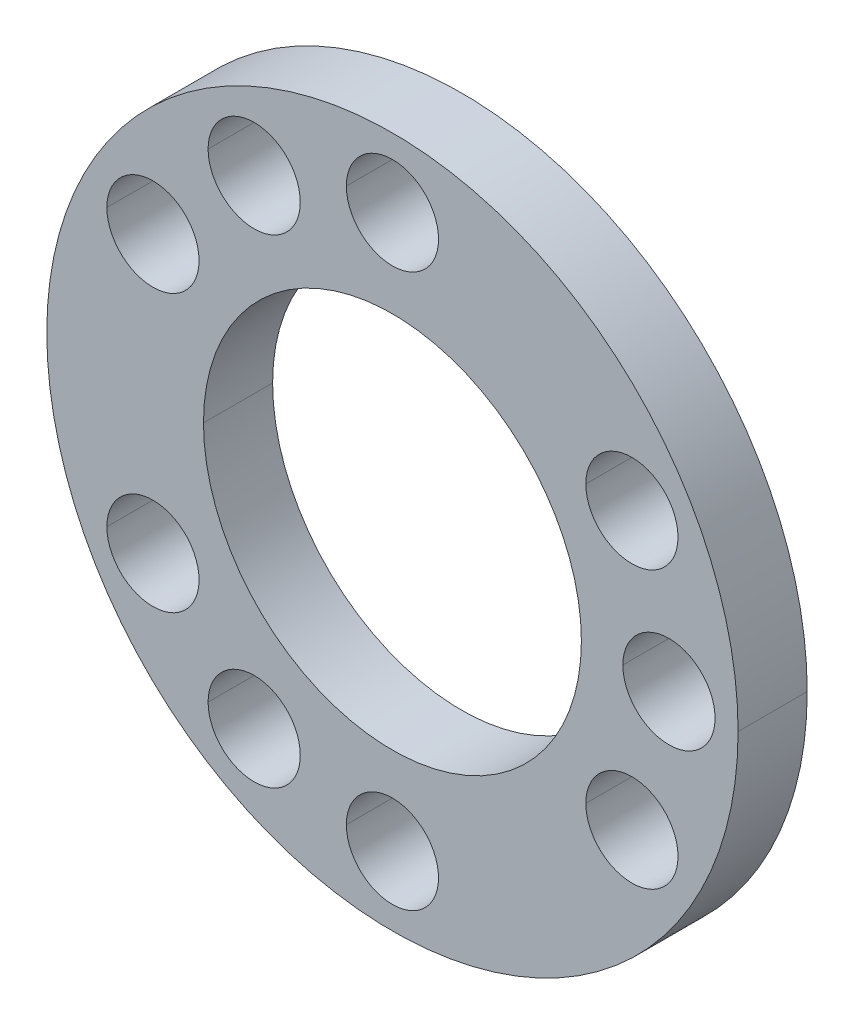
ISO-10303-21;
HEADER;
FILE_DESCRIPTION(('STEP AP214'),'2;1');
FILE_NAME('part.step','',(''),(''),'','','');
FILE_SCHEMA(('AUTOMOTIVE_DESIGN { 1 0 10303 214 1 1 1 1 }'));
ENDSEC;
DATA;
#1=APPLICATION_CONTEXT('core data for automotive mechanical design processes');
#2=APPLICATION_PROTOCOL_DEFINITION('international standard','automotive_design',2000,#1);
#3=PRODUCT_CONTEXT('',#1,'mechanical');
#4=PRODUCT('Part','Part','',(#3));
#5=PRODUCT_RELATED_PRODUCT_CATEGORY('part','',(#4));
#6=PRODUCT_DEFINITION_FORMATION('','',#4);
#7=PRODUCT_DEFINITION_CONTEXT('part definition',#1,'design');
#8=PRODUCT_DEFINITION('design','',#6,#7);
#9=PRODUCT_DEFINITION_SHAPE('','',#8);
#10=(LENGTH_UNIT() NAMED_UNIT(*) SI_UNIT(.MILLI.,.METRE.));
#11=(NAMED_UNIT(*) PLANE_ANGLE_UNIT() SI_UNIT($,.RADIAN.));
#12=(NAMED_UNIT(*) SI_UNIT($,.STERADIAN.) SOLID_ANGLE_UNIT());
#13=UNCERTAINTY_MEASURE_WITH_UNIT(LENGTH_MEASURE(1.E-05),#10,'distance_accuracy_value','');
#14=(GEOMETRIC_REPRESENTATION_CONTEXT(3) GLOBAL_UNCERTAINTY_ASSIGNED_CONTEXT((#13)) GLOBAL_UNIT_ASSIGNED_CONTEXT((#10,
#11,#12)) REPRESENTATION_CONTEXT('',''));
#15=CARTESIAN_POINT('',(0.,0.,0.));
#16=DIRECTION('',(0.,0.,1.));
#17=DIRECTION('',(1.,0.,0.));
#18=AXIS2_PLACEMENT_3D('',#15,#16,#17);
#19=CARTESIAN_POINT('',(0.,0.,-13.));
#20=DIRECTION('',(0.,0.,1.));
#21=DIRECTION('',(1.,0.,0.));
#22=AXIS2_PLACEMENT_3D('',#19,#20,#21);
#23=CYLINDRICAL_SURFACE('',#22,8.2);
#24=CARTESIAN_POINT('',(0.,0.,0.));
#25=DIRECTION('',(0.,0.,1.));
#26=DIRECTION('',(1.,0.,0.));
#27=AXIS2_PLACEMENT_3D('',#24,#25,#26);
#28=CIRCLE('',#27,8.2);
#29=CARTESIAN_POINT('',(-8.2,0.,0.));
#30=VERTEX_POINT('',#29);
#31=CARTESIAN_POINT('',(8.2,0.,0.));
#32=VERTEX_POINT('',#31);
#33=EDGE_CURVE('E42',#30,#32,#28,.T.);
#34=ORIENTED_EDGE('',*,*,#33,.F.);
#35=DIRECTION('',(0.,0.,1.));
#36=VECTOR('',#35,1.);
#37=CARTESIAN_POINT('',(-8.2,0.,-13.));
#38=LINE('',#37,#36);
#39=CARTESIAN_POINT('',(-8.2,0.,3.));
#40=VERTEX_POINT('',#39);
#41=EDGE_CURVE('E11',#30,#40,#38,.T.);
#42=ORIENTED_EDGE('',*,*,#41,.T.);
#43=CARTESIAN_POINT('',(0.,0.,3.));
#44=DIRECTION('',(0.,0.,1.));
#45=DIRECTION('',(1.,0.,0.));
#46=AXIS2_PLACEMENT_3D('',#43,#44,#45);
#47=CIRCLE('',#46,8.2);
#48=CARTESIAN_POINT('',(8.2,0.,3.));
#49=VERTEX_POINT('',#48);
#50=EDGE_CURVE('E28',#40,#49,#47,.T.);
#51=ORIENTED_EDGE('',*,*,#50,.T.);
#52=DIRECTION('',(0.,0.,1.));
#53=VECTOR('',#52,1.);
#54=CARTESIAN_POINT('',(8.2,0.,-13.));
#55=LINE('',#54,#53);
#56=EDGE_CURVE('E278',#32,#49,#55,.T.);
#57=ORIENTED_EDGE('',*,*,#56,.F.);
#58=EDGE_LOOP('',(#34,#42,#51,#57));
#59=FACE_BOUND('',#58,.T.);
#60=ADVANCED_FACE('F17',(#59),#23,.F.);
#61=CARTESIAN_POINT('',(-5.99999999999911,-10.3923048454132,7.));
#62=DIRECTION('',(0.,0.,-1.));
#63=DIRECTION('',(-1.,0.,0.));
#64=AXIS2_PLACEMENT_3D('',#61,#62,#63);
#65=CYLINDRICAL_SURFACE('',#64,2.);
#66=CARTESIAN_POINT('',(-5.99999999999911,-10.3923048454132,3.));
#67=DIRECTION('',(0.,0.,1.));
#68=DIRECTION('',(1.,0.,0.));
#69=AXIS2_PLACEMENT_3D('',#66,#67,#68);
#70=CIRCLE('',#69,2.);
#71=CARTESIAN_POINT('',(-7.99999999999911,-10.3923048454132,3.));
#72=VERTEX_POINT('',#71);
#73=CARTESIAN_POINT('',(-3.99999999999911,-10.3923048454132,3.));
#74=VERTEX_POINT('',#73);
#75=EDGE_CURVE('E255',#72,#74,#70,.T.);
#76=ORIENTED_EDGE('',*,*,#75,.T.);
#77=DIRECTION('',(0.,0.,-1.));
#78=VECTOR('',#77,1.);
#79=CARTESIAN_POINT('',(-3.99999999999911,-10.3923048454132,7.));
#80=LINE('',#79,#78);
#81=CARTESIAN_POINT('',(-3.99999999999911,-10.3923048454132,0.));
#82=VERTEX_POINT('',#81);
#83=EDGE_CURVE('E378',#74,#82,#80,.T.);
#84=ORIENTED_EDGE('',*,*,#83,.T.);
#85=CARTESIAN_POINT('',(-5.99999999999911,-10.3923048454132,0.));
#86=DIRECTION('',(0.,0.,1.));
#87=DIRECTION('',(1.,0.,0.));
#88=AXIS2_PLACEMENT_3D('',#85,#86,#87);
#89=CIRCLE('',#88,2.);
#90=CARTESIAN_POINT('',(-7.99999999999911,-10.3923048454132,0.));
#91=VERTEX_POINT('',#90);
#92=EDGE_CURVE('E256',#91,#82,#89,.T.);
#93=ORIENTED_EDGE('',*,*,#92,.F.);
#94=DIRECTION('',(0.,0.,-1.));
#95=VECTOR('',#94,1.);
#96=CARTESIAN_POINT('',(-7.99999999999911,-10.3923048454132,7.));
#97=LINE('',#96,#95);
#98=EDGE_CURVE('E383',#72,#91,#97,.T.);
#99=ORIENTED_EDGE('',*,*,#98,.F.);
#100=EDGE_LOOP('',(#76,#84,#93,#99));
#101=FACE_BOUND('',#100,.T.);
#102=ADVANCED_FACE('F751',(#101),#65,.F.);
#103=CARTESIAN_POINT('',(12.0000000000004,8.14669512405608E-13,7.));
#104=DIRECTION('',(0.,0.,-1.));
#105=DIRECTION('',(-1.,0.,0.));
#106=AXIS2_PLACEMENT_3D('',#103,#104,#105);
#107=CYLINDRICAL_SURFACE('',#106,2.);
#108=CARTESIAN_POINT('',(12.0000000000004,8.14669512405608E-13,3.));
#109=DIRECTION('',(0.,0.,1.));
#110=DIRECTION('',(1.,0.,0.));
#111=AXIS2_PLACEMENT_3D('',#108,#109,#110);
#112=CIRCLE('',#111,2.);
#113=CARTESIAN_POINT('',(10.0000000000004,8.14669512405608E-13,3.));
#114=VERTEX_POINT('',#113);
#115=CARTESIAN_POINT('',(14.0000000000004,8.14914441765438E-13,3.));
#116=VERTEX_POINT('',#115);
#117=EDGE_CURVE('E329',#114,#116,#112,.T.);
#118=ORIENTED_EDGE('',*,*,#117,.T.);
#119=DIRECTION('',(0.,0.,-1.));
#120=VECTOR('',#119,1.);
#121=CARTESIAN_POINT('',(14.0000000000004,8.14914441765438E-13,7.));
#122=LINE('',#121,#120);
#123=CARTESIAN_POINT('',(14.0000000000004,8.14914441765438E-13,0.));
#124=VERTEX_POINT('',#123);
#125=EDGE_CURVE('E306',#116,#124,#122,.T.);
#126=ORIENTED_EDGE('',*,*,#125,.T.);
#127=CARTESIAN_POINT('',(12.0000000000004,8.14669512405608E-13,0.));
#128=DIRECTION('',(0.,0.,1.));
#129=DIRECTION('',(1.,0.,0.));
#130=AXIS2_PLACEMENT_3D('',#127,#128,#129);
#131=CIRCLE('',#130,2.);
#132=CARTESIAN_POINT('',(10.0000000000004,8.14669512405608E-13,0.));
#133=VERTEX_POINT('',#132);
#134=EDGE_CURVE('E228',#133,#124,#131,.T.);
#135=ORIENTED_EDGE('',*,*,#134,.F.);
#136=DIRECTION('',(0.,0.,-1.));
#137=VECTOR('',#136,1.);
#138=CARTESIAN_POINT('',(10.0000000000004,8.14669512405608E-13,7.));
#139=LINE('',#138,#137);
#140=EDGE_CURVE('E282',#114,#133,#139,.T.);
#141=ORIENTED_EDGE('',*,*,#140,.F.);
#142=EDGE_LOOP('',(#118,#126,#135,#141));
#143=FACE_BOUND('',#142,.T.);
#144=ADVANCED_FACE('F462',(#143),#107,.F.);
#145=CARTESIAN_POINT('',(-10.3923048454128,5.99999999999971,7.));
#146=DIRECTION('',(0.,0.,-1.));
#147=DIRECTION('',(-1.,0.,0.));
#148=AXIS2_PLACEMENT_3D('',#145,#146,#147);
#149=CYLINDRICAL_SURFACE('',#148,2.00000000000031);
#150=CARTESIAN_POINT('',(-10.3923048454128,5.99999999999971,3.));
#151=DIRECTION('',(0.,0.,1.));
#152=DIRECTION('',(1.,0.,0.));
#153=AXIS2_PLACEMENT_3D('',#150,#151,#152);
#154=CIRCLE('',#153,2.00000000000031);
#155=CARTESIAN_POINT('',(-12.3923048454131,5.99999999999971,3.));
#156=VERTEX_POINT('',#155);
#157=CARTESIAN_POINT('',(-8.39230484541245,5.99999999999971,3.));
#158=VERTEX_POINT('',#157);
#159=EDGE_CURVE('E303',#156,#158,#154,.T.);
#160=ORIENTED_EDGE('',*,*,#159,.T.);
#161=DIRECTION('',(0.,0.,-1.));
#162=VECTOR('',#161,1.);
#163=CARTESIAN_POINT('',(-8.39230484541245,5.99999999999971,7.));
#164=LINE('',#163,#162);
#165=CARTESIAN_POINT('',(-8.39230484541245,5.99999999999971,0.));
#166=VERTEX_POINT('',#165);
#167=EDGE_CURVE('E209',#158,#166,#164,.T.);
#168=ORIENTED_EDGE('',*,*,#167,.T.);
#169=CARTESIAN_POINT('',(-10.3923048454128,5.99999999999971,0.));
#170=DIRECTION('',(0.,0.,1.));
#171=DIRECTION('',(1.,0.,0.));
#172=AXIS2_PLACEMENT_3D('',#169,#170,#171);
#173=CIRCLE('',#172,2.00000000000031);
#174=CARTESIAN_POINT('',(-12.3923048454131,5.99999999999971,0.));
#175=VERTEX_POINT('',#174);
#176=EDGE_CURVE('E203',#175,#166,#173,.T.);
#177=ORIENTED_EDGE('',*,*,#176,.F.);
#178=DIRECTION('',(0.,0.,-1.));
#179=VECTOR('',#178,1.);
#180=CARTESIAN_POINT('',(-12.3923048454131,5.99999999999971,7.));
#181=LINE('',#180,#179);
#182=EDGE_CURVE('E207',#156,#175,#181,.T.);
#183=ORIENTED_EDGE('',*,*,#182,.F.);
#184=EDGE_LOOP('',(#160,#168,#177,#183));
#185=FACE_BOUND('',#184,.T.);
#186=ADVANCED_FACE('F206',(#185),#149,.F.);
#187=CARTESIAN_POINT('',(-10.3923048454122,-6.,7.));
#188=DIRECTION('',(0.,0.,-1.));
#189=DIRECTION('',(-1.,0.,0.));
#190=AXIS2_PLACEMENT_3D('',#187,#188,#189);
#191=CYLINDRICAL_SURFACE('',#190,2.00000000000085);
#192=CARTESIAN_POINT('',(-10.3923048454122,-6.,3.));
#193=DIRECTION('',(0.,0.,1.));
#194=DIRECTION('',(1.,0.,0.));
#195=AXIS2_PLACEMENT_3D('',#192,#193,#194);
#196=CIRCLE('',#195,2.00000000000085);
#197=CARTESIAN_POINT('',(-12.3923048454131,-6.,3.));
#198=VERTEX_POINT('',#197);
#199=CARTESIAN_POINT('',(-8.3923048454114,-6.,3.));
#200=VERTEX_POINT('',#199);
#201=EDGE_CURVE('E291',#198,#200,#196,.T.);
#202=ORIENTED_EDGE('',*,*,#201,.T.);
#203=DIRECTION('',(0.,0.,-1.));
#204=VECTOR('',#203,1.);
#205=CARTESIAN_POINT('',(-8.3923048454114,-6.,7.));
#206=LINE('',#205,#204);
#207=CARTESIAN_POINT('',(-8.3923048454114,-6.,0.));
#208=VERTEX_POINT('',#207);
#209=EDGE_CURVE('E295',#200,#208,#206,.T.);
#210=ORIENTED_EDGE('',*,*,#209,.T.);
#211=CARTESIAN_POINT('',(-10.3923048454122,-6.,0.));
#212=DIRECTION('',(0.,0.,1.));
#213=DIRECTION('',(1.,0.,0.));
#214=AXIS2_PLACEMENT_3D('',#211,#212,#213);
#215=CIRCLE('',#214,2.00000000000085);
#216=CARTESIAN_POINT('',(-12.3923048454131,-6.,0.));
#217=VERTEX_POINT('',#216);
#218=EDGE_CURVE('E395',#217,#208,#215,.T.);
#219=ORIENTED_EDGE('',*,*,#218,.F.);
#220=DIRECTION('',(0.,0.,-1.));
#221=VECTOR('',#220,1.);
#222=CARTESIAN_POINT('',(-12.3923048454131,-6.,7.));
#223=LINE('',#222,#221);
#224=EDGE_CURVE('E277',#198,#217,#223,.T.);
#225=ORIENTED_EDGE('',*,*,#224,.F.);
#226=EDGE_LOOP('',(#202,#210,#219,#225));
#227=FACE_BOUND('',#226,.T.);
#228=ADVANCED_FACE('F504',(#227),#191,.F.);
#229=CARTESIAN_POINT('',(1.01532524224664E-12,-11.9999999999994,7.));
#230=DIRECTION('',(0.,0.,-1.));
#231=DIRECTION('',(-1.,0.,0.));
#232=AXIS2_PLACEMENT_3D('',#229,#230,#231);
#233=CYLINDRICAL_SURFACE('',#232,2.00000000000123);
#234=CARTESIAN_POINT('',(1.01532524224664E-12,-11.9999999999994,3.));
#235=DIRECTION('',(0.,0.,1.));
#236=DIRECTION('',(1.,0.,0.));
#237=AXIS2_PLACEMENT_3D('',#234,#235,#236);
#238=CIRCLE('',#237,2.00000000000123);
#239=CARTESIAN_POINT('',(-2.00000000000021,-11.9999999999994,3.));
#240=VERTEX_POINT('',#239);
#241=CARTESIAN_POINT('',(2.00000000000224,-11.9999999999994,3.));
#242=VERTEX_POINT('',#241);
#243=EDGE_CURVE('E374',#240,#242,#238,.T.);
#244=ORIENTED_EDGE('',*,*,#243,.T.);
#245=DIRECTION('',(0.,0.,-1.));
#246=VECTOR('',#245,1.);
#247=CARTESIAN_POINT('',(2.00000000000224,-11.9999999999994,7.));
#248=LINE('',#247,#246);
#249=CARTESIAN_POINT('',(2.00000000000224,-11.9999999999994,0.));
#250=VERTEX_POINT('',#249);
#251=EDGE_CURVE('E243',#242,#250,#248,.T.);
#252=ORIENTED_EDGE('',*,*,#251,.T.);
#253=CARTESIAN_POINT('',(1.01532524224664E-12,-11.9999999999994,0.));
#254=DIRECTION('',(0.,0.,1.));
#255=DIRECTION('',(1.,0.,0.));
#256=AXIS2_PLACEMENT_3D('',#253,#254,#255);
#257=CIRCLE('',#256,2.00000000000123);
#258=CARTESIAN_POINT('',(-2.00000000000021,-11.9999999999994,0.));
#259=VERTEX_POINT('',#258);
#260=EDGE_CURVE('E370',#259,#250,#257,.T.);
#261=ORIENTED_EDGE('',*,*,#260,.F.);
#262=DIRECTION('',(0.,0.,-1.));
#263=VECTOR('',#262,1.);
#264=CARTESIAN_POINT('',(-2.00000000000021,-11.9999999999994,7.));
#265=LINE('',#264,#263);
#266=EDGE_CURVE('E276',#240,#259,#265,.T.);
#267=ORIENTED_EDGE('',*,*,#266,.F.);
#268=EDGE_LOOP('',(#244,#252,#261,#267));
#269=FACE_BOUND('',#268,.T.);
#270=ADVANCED_FACE('F712',(#269),#233,.F.);
#271=CARTESIAN_POINT('',(10.3923048454138,-5.99999999999911,7.));
#272=DIRECTION('',(0.,0.,-1.));
#273=DIRECTION('',(-1.,0.,0.));
#274=AXIS2_PLACEMENT_3D('',#271,#272,#273);
#275=CYLINDRICAL_SURFACE('',#274,2.00000000000104);
#276=CARTESIAN_POINT('',(10.3923048454138,-5.99999999999911,3.));
#277=DIRECTION('',(0.,0.,1.));
#278=DIRECTION('',(1.,0.,0.));
#279=AXIS2_PLACEMENT_3D('',#276,#277,#278);
#280=CIRCLE('',#279,2.00000000000104);
#281=CARTESIAN_POINT('',(8.39230484541273,-5.99999999999911,3.));
#282=VERTEX_POINT('',#281);
#283=CARTESIAN_POINT('',(12.3923048454148,-5.99999999999911,3.));
#284=VERTEX_POINT('',#283);
#285=EDGE_CURVE('E241',#282,#284,#280,.T.);
#286=ORIENTED_EDGE('',*,*,#285,.T.);
#287=DIRECTION('',(0.,0.,-1.));
#288=VECTOR('',#287,1.);
#289=CARTESIAN_POINT('',(12.3923048454148,-5.99999999999911,7.));
#290=LINE('',#289,#288);
#291=CARTESIAN_POINT('',(12.3923048454148,-5.99999999999911,0.));
#292=VERTEX_POINT('',#291);
#293=EDGE_CURVE('E244',#284,#292,#290,.T.);
#294=ORIENTED_EDGE('',*,*,#293,.T.);
#295=CARTESIAN_POINT('',(10.3923048454138,-5.99999999999911,0.));
#296=DIRECTION('',(0.,0.,1.));
#297=DIRECTION('',(1.,0.,0.));
#298=AXIS2_PLACEMENT_3D('',#295,#296,#297);
#299=CIRCLE('',#298,2.00000000000104);
#300=CARTESIAN_POINT('',(8.39230484541273,-5.99999999999911,0.));
#301=VERTEX_POINT('',#300);
#302=EDGE_CURVE('E296',#301,#292,#299,.T.);
#303=ORIENTED_EDGE('',*,*,#302,.F.);
#304=DIRECTION('',(0.,0.,-1.));
#305=VECTOR('',#304,1.);
#306=CARTESIAN_POINT('',(8.39230484541273,-5.99999999999911,7.));
#307=LINE('',#306,#305);
#308=EDGE_CURVE('E307',#282,#301,#307,.T.);
#309=ORIENTED_EDGE('',*,*,#308,.F.);
#310=EDGE_LOOP('',(#286,#294,#303,#309));
#311=FACE_BOUND('',#310,.T.);
#312=ADVANCED_FACE('F707',(#311),#275,.F.);
#313=CARTESIAN_POINT('',(10.3923048454133,6.00000000000059,7.));
#314=DIRECTION('',(0.,0.,-1.));
#315=DIRECTION('',(-1.,0.,0.));
#316=AXIS2_PLACEMENT_3D('',#313,#314,#315);
#317=CYLINDRICAL_SURFACE('',#316,2.00000000000043);
#318=CARTESIAN_POINT('',(10.3923048454133,6.00000000000059,3.));
#319=DIRECTION('',(0.,0.,1.));
#320=DIRECTION('',(1.,0.,0.));
#321=AXIS2_PLACEMENT_3D('',#318,#319,#320);
#322=CIRCLE('',#321,2.00000000000043);
#323=CARTESIAN_POINT('',(8.39230484541283,6.00000000000059,3.));
#324=VERTEX_POINT('',#323);
#325=CARTESIAN_POINT('',(12.3923048454137,6.00000000000059,3.));
#326=VERTEX_POINT('',#325);
#327=EDGE_CURVE('E362',#324,#326,#322,.T.);
#328=ORIENTED_EDGE('',*,*,#327,.T.);
#329=DIRECTION('',(0.,0.,-1.));
#330=VECTOR('',#329,1.);
#331=CARTESIAN_POINT('',(12.3923048454137,6.00000000000059,7.));
#332=LINE('',#331,#330);
#333=CARTESIAN_POINT('',(12.3923048454137,6.00000000000059,0.));
#334=VERTEX_POINT('',#333);
#335=EDGE_CURVE('E405',#326,#334,#332,.T.);
#336=ORIENTED_EDGE('',*,*,#335,.T.);
#337=CARTESIAN_POINT('',(10.3923048454133,6.00000000000059,0.));
#338=DIRECTION('',(0.,0.,1.));
#339=DIRECTION('',(1.,0.,0.));
#340=AXIS2_PLACEMENT_3D('',#337,#338,#339);
#341=CIRCLE('',#340,2.00000000000043);
#342=CARTESIAN_POINT('',(8.39230484541283,6.00000000000059,0.));
#343=VERTEX_POINT('',#342);
#344=EDGE_CURVE('E271',#343,#334,#341,.T.);
#345=ORIENTED_EDGE('',*,*,#344,.F.);
#346=DIRECTION('',(0.,0.,-1.));
#347=VECTOR('',#346,1.);
#348=CARTESIAN_POINT('',(8.39230484541283,6.00000000000059,7.));
#349=LINE('',#348,#347);
#350=EDGE_CURVE('E290',#324,#343,#349,.T.);
#351=ORIENTED_EDGE('',*,*,#350,.F.);
#352=EDGE_LOOP('',(#328,#336,#345,#351));
#353=FACE_BOUND('',#352,.T.);
#354=ADVANCED_FACE('F711',(#353),#317,.F.);
#355=CARTESIAN_POINT('',(-6.,10.3923048454133,7.));
#356=DIRECTION('',(0.,0.,-1.));
#357=DIRECTION('',(-1.,0.,0.));
#358=AXIS2_PLACEMENT_3D('',#355,#356,#357);
#359=CYLINDRICAL_SURFACE('',#358,2.);
#360=CARTESIAN_POINT('',(-6.,10.3923048454133,3.));
#361=DIRECTION('',(0.,0.,1.));
#362=DIRECTION('',(1.,0.,0.));
#363=AXIS2_PLACEMENT_3D('',#360,#361,#362);
#364=CIRCLE('',#363,2.);
#365=CARTESIAN_POINT('',(-8.,10.3923048454133,3.));
#366=VERTEX_POINT('',#365);
#367=CARTESIAN_POINT('',(-4.,10.3923048454133,3.));
#368=VERTEX_POINT('',#367);
#369=EDGE_CURVE('E401',#366,#368,#364,.T.);
#370=ORIENTED_EDGE('',*,*,#369,.T.);
#371=DIRECTION('',(0.,0.,-1.));
#372=VECTOR('',#371,1.);
#373=CARTESIAN_POINT('',(-4.,10.3923048454133,7.));
#374=LINE('',#373,#372);
#375=CARTESIAN_POINT('',(-4.,10.3923048454133,0.));
#376=VERTEX_POINT('',#375);
#377=EDGE_CURVE('E239',#368,#376,#374,.T.);
#378=ORIENTED_EDGE('',*,*,#377,.T.);
#379=CARTESIAN_POINT('',(-6.,10.3923048454133,0.));
#380=DIRECTION('',(0.,0.,1.));
#381=DIRECTION('',(1.,0.,0.));
#382=AXIS2_PLACEMENT_3D('',#379,#380,#381);
#383=CIRCLE('',#382,2.);
#384=CARTESIAN_POINT('',(-8.,10.3923048454133,0.));
#385=VERTEX_POINT('',#384);
#386=EDGE_CURVE('E270',#385,#376,#383,.T.);
#387=ORIENTED_EDGE('',*,*,#386,.F.);
#388=DIRECTION('',(0.,0.,-1.));
#389=VECTOR('',#388,1.);
#390=CARTESIAN_POINT('',(-8.,10.3923048454133,7.));
#391=LINE('',#390,#389);
#392=EDGE_CURVE('E246',#366,#385,#391,.T.);
#393=ORIENTED_EDGE('',*,*,#392,.F.);
#394=EDGE_LOOP('',(#370,#378,#387,#393));
#395=FACE_BOUND('',#394,.T.);
#396=ADVANCED_FACE('F825',(#395),#359,.F.);
#397=CARTESIAN_POINT('',(0.,12.,7.));
#398=DIRECTION('',(0.,0.,-1.));
#399=DIRECTION('',(-1.,0.,0.));
#400=AXIS2_PLACEMENT_3D('',#397,#398,#399);
#401=CYLINDRICAL_SURFACE('',#400,2.);
#402=CARTESIAN_POINT('',(0.,12.,3.));
#403=DIRECTION('',(0.,0.,1.));
#404=DIRECTION('',(1.,0.,0.));
#405=AXIS2_PLACEMENT_3D('',#402,#403,#404);
#406=CIRCLE('',#405,2.);
#407=CARTESIAN_POINT('',(-2.,12.,3.));
#408=VERTEX_POINT('',#407);
#409=CARTESIAN_POINT('',(2.,12.,3.));
#410=VERTEX_POINT('',#409);
#411=EDGE_CURVE('E363',#408,#410,#406,.T.);
#412=ORIENTED_EDGE('',*,*,#411,.T.);
#413=DIRECTION('',(0.,0.,-1.));
#414=VECTOR('',#413,1.);
#415=CARTESIAN_POINT('',(2.,12.,7.));
#416=LINE('',#415,#414);
#417=CARTESIAN_POINT('',(2.,12.,0.));
#418=VERTEX_POINT('',#417);
#419=EDGE_CURVE('E358',#410,#418,#416,.T.);
#420=ORIENTED_EDGE('',*,*,#419,.T.);
#421=CARTESIAN_POINT('',(0.,12.,0.));
#422=DIRECTION('',(0.,0.,1.));
#423=DIRECTION('',(1.,0.,0.));
#424=AXIS2_PLACEMENT_3D('',#421,#422,#423);
#425=CIRCLE('',#424,2.);
#426=CARTESIAN_POINT('',(-2.,12.,0.));
#427=VERTEX_POINT('',#426);
#428=EDGE_CURVE('E321',#427,#418,#425,.T.);
#429=ORIENTED_EDGE('',*,*,#428,.F.);
#430=DIRECTION('',(0.,0.,-1.));
#431=VECTOR('',#430,1.);
#432=CARTESIAN_POINT('',(-2.,12.,7.));
#433=LINE('',#432,#431);
#434=EDGE_CURVE('E330',#408,#427,#433,.T.);
#435=ORIENTED_EDGE('',*,*,#434,.F.);
#436=EDGE_LOOP('',(#412,#420,#429,#435));
#437=FACE_BOUND('',#436,.T.);
#438=ADVANCED_FACE('F487',(#437),#401,.F.);
#439=CARTESIAN_POINT('',(0.,0.,7.));
#440=DIRECTION('',(0.,0.,-1.));
#441=DIRECTION('',(-1.,0.,0.));
#442=AXIS2_PLACEMENT_3D('',#439,#440,#441);
#443=CYLINDRICAL_SURFACE('',#442,15.);
#444=CARTESIAN_POINT('',(0.,0.,3.));
#445=DIRECTION('',(0.,0.,1.));
#446=DIRECTION('',(1.,0.,0.));
#447=AXIS2_PLACEMENT_3D('',#444,#445,#446);
#448=CIRCLE('',#447,15.);
#449=CARTESIAN_POINT('',(15.,0.,3.));
#450=VERTEX_POINT('',#449);
#451=CARTESIAN_POINT('',(-15.,0.,3.));
#452=VERTEX_POINT('',#451);
#453=EDGE_CURVE('E21',#450,#452,#448,.T.);
#454=ORIENTED_EDGE('',*,*,#453,.F.);
#455=DIRECTION('',(0.,0.,-1.));
#456=VECTOR('',#455,1.);
#457=CARTESIAN_POINT('',(15.,0.,7.));
#458=LINE('',#457,#456);
#459=CARTESIAN_POINT('',(15.,0.,0.));
#460=VERTEX_POINT('',#459);
#461=EDGE_CURVE('E264',#450,#460,#458,.T.);
#462=ORIENTED_EDGE('',*,*,#461,.T.);
#463=CARTESIAN_POINT('',(0.,0.,0.));
#464=DIRECTION('',(0.,0.,1.));
#465=DIRECTION('',(1.,0.,0.));
#466=AXIS2_PLACEMENT_3D('',#463,#464,#465);
#467=CIRCLE('',#466,15.);
#468=CARTESIAN_POINT('',(-15.,0.,0.));
#469=VERTEX_POINT('',#468);
#470=EDGE_CURVE('E260',#460,#469,#467,.T.);
#471=ORIENTED_EDGE('',*,*,#470,.T.);
#472=DIRECTION('',(0.,0.,-1.));
#473=VECTOR('',#472,1.);
#474=CARTESIAN_POINT('',(-15.,0.,7.));
#475=LINE('',#474,#473);
#476=EDGE_CURVE('E265',#452,#469,#475,.T.);
#477=ORIENTED_EDGE('',*,*,#476,.F.);
#478=EDGE_LOOP('',(#454,#462,#471,#477));
#479=FACE_BOUND('',#478,.T.);
#480=ADVANCED_FACE('F733',(#479),#443,.T.);
#481=CARTESIAN_POINT('',(0.,0.,7.));
#482=DIRECTION('',(0.,0.,-1.));
#483=DIRECTION('',(-1.,0.,0.));
#484=AXIS2_PLACEMENT_3D('',#481,#482,#483);
#485=CYLINDRICAL_SURFACE('',#484,15.);
#486=ORIENTED_EDGE('',*,*,#461,.F.);
#487=CARTESIAN_POINT('',(0.,0.,3.));
#488=DIRECTION('',(0.,0.,1.));
#489=DIRECTION('',(1.,0.,0.));
#490=AXIS2_PLACEMENT_3D('',#487,#488,#489);
#491=CIRCLE('',#490,15.);
#492=EDGE_CURVE('E316',#452,#450,#491,.T.);
#493=ORIENTED_EDGE('',*,*,#492,.F.);
#494=ORIENTED_EDGE('',*,*,#476,.T.);
#495=CARTESIAN_POINT('',(0.,0.,0.));
#496=DIRECTION('',(0.,0.,1.));
#497=DIRECTION('',(1.,0.,0.));
#498=AXIS2_PLACEMENT_3D('',#495,#496,#497);
#499=CIRCLE('',#498,15.);
#500=EDGE_CURVE('E342',#469,#460,#499,.T.);
#501=ORIENTED_EDGE('',*,*,#500,.T.);
#502=EDGE_LOOP('',(#486,#493,#494,#501));
#503=FACE_BOUND('',#502,.T.);
#504=ADVANCED_FACE('F729',(#503),#485,.T.);
#505=CARTESIAN_POINT('',(0.,12.,7.));
#506=DIRECTION('',(0.,0.,-1.));
#507=DIRECTION('',(-1.,0.,0.));
#508=AXIS2_PLACEMENT_3D('',#505,#506,#507);
#509=CYLINDRICAL_SURFACE('',#508,2.);
#510=ORIENTED_EDGE('',*,*,#419,.F.);
#511=CARTESIAN_POINT('',(0.,12.,3.));
#512=DIRECTION('',(0.,0.,1.));
#513=DIRECTION('',(1.,0.,0.));
#514=AXIS2_PLACEMENT_3D('',#511,#512,#513);
#515=CIRCLE('',#514,2.);
#516=EDGE_CURVE('E333',#410,#408,#515,.T.);
#517=ORIENTED_EDGE('',*,*,#516,.T.);
#518=ORIENTED_EDGE('',*,*,#434,.T.);
#519=CARTESIAN_POINT('',(0.,12.,0.));
#520=DIRECTION('',(0.,0.,1.));
#521=DIRECTION('',(1.,0.,0.));
#522=AXIS2_PLACEMENT_3D('',#519,#520,#521);
#523=CIRCLE('',#522,2.);
#524=EDGE_CURVE('E317',#418,#427,#523,.T.);
#525=ORIENTED_EDGE('',*,*,#524,.F.);
#526=EDGE_LOOP('',(#510,#517,#518,#525));
#527=FACE_BOUND('',#526,.T.);
#528=ADVANCED_FACE('F486',(#527),#509,.F.);
#529=CARTESIAN_POINT('',(-6.,10.3923048454133,7.));
#530=DIRECTION('',(0.,0.,-1.));
#531=DIRECTION('',(-1.,0.,0.));
#532=AXIS2_PLACEMENT_3D('',#529,#530,#531);
#533=CYLINDRICAL_SURFACE('',#532,2.);
#534=ORIENTED_EDGE('',*,*,#377,.F.);
#535=CARTESIAN_POINT('',(-6.,10.3923048454133,3.));
#536=DIRECTION('',(0.,0.,1.));
#537=DIRECTION('',(1.,0.,0.));
#538=AXIS2_PLACEMENT_3D('',#535,#536,#537);
#539=CIRCLE('',#538,2.);
#540=EDGE_CURVE('E250',#368,#366,#539,.T.);
#541=ORIENTED_EDGE('',*,*,#540,.T.);
#542=ORIENTED_EDGE('',*,*,#392,.T.);
#543=CARTESIAN_POINT('',(-6.,10.3923048454133,0.));
#544=DIRECTION('',(0.,0.,1.));
#545=DIRECTION('',(1.,0.,0.));
#546=AXIS2_PLACEMENT_3D('',#543,#544,#545);
#547=CIRCLE('',#546,2.);
#548=EDGE_CURVE('E266',#376,#385,#547,.T.);
#549=ORIENTED_EDGE('',*,*,#548,.F.);
#550=EDGE_LOOP('',(#534,#541,#542,#549));
#551=FACE_BOUND('',#550,.T.);
#552=ADVANCED_FACE('F723',(#551),#533,.F.);
#553=CARTESIAN_POINT('',(10.3923048454133,6.00000000000059,7.));
#554=DIRECTION('',(0.,0.,-1.));
#555=DIRECTION('',(-1.,0.,0.));
#556=AXIS2_PLACEMENT_3D('',#553,#554,#555);
#557=CYLINDRICAL_SURFACE('',#556,2.00000000000043);
#558=ORIENTED_EDGE('',*,*,#335,.F.);
#559=CARTESIAN_POINT('',(10.3923048454133,6.00000000000059,3.));
#560=DIRECTION('',(0.,0.,1.));
#561=DIRECTION('',(1.,0.,0.));
#562=AXIS2_PLACEMENT_3D('',#559,#560,#561);
#563=CIRCLE('',#562,2.00000000000043);
#564=EDGE_CURVE('E251',#326,#324,#563,.T.);
#565=ORIENTED_EDGE('',*,*,#564,.T.);
#566=ORIENTED_EDGE('',*,*,#350,.T.);
#567=CARTESIAN_POINT('',(10.3923048454133,6.00000000000059,0.));
#568=DIRECTION('',(0.,0.,1.));
#569=DIRECTION('',(1.,0.,0.));
#570=AXIS2_PLACEMENT_3D('',#567,#568,#569);
#571=CIRCLE('',#570,2.00000000000043);
#572=EDGE_CURVE('E299',#334,#343,#571,.T.);
#573=ORIENTED_EDGE('',*,*,#572,.F.);
#574=EDGE_LOOP('',(#558,#565,#566,#573));
#575=FACE_BOUND('',#574,.T.);
#576=ADVANCED_FACE('F718',(#575),#557,.F.);
#577=CARTESIAN_POINT('',(10.3923048454138,-5.99999999999911,7.));
#578=DIRECTION('',(0.,0.,-1.));
#579=DIRECTION('',(-1.,0.,0.));
#580=AXIS2_PLACEMENT_3D('',#577,#578,#579);
#581=CYLINDRICAL_SURFACE('',#580,2.00000000000104);
#582=ORIENTED_EDGE('',*,*,#293,.F.);
#583=CARTESIAN_POINT('',(10.3923048454138,-5.99999999999911,3.));
#584=DIRECTION('',(0.,0.,1.));
#585=DIRECTION('',(1.,0.,0.));
#586=AXIS2_PLACEMENT_3D('',#583,#584,#585);
#587=CIRCLE('',#586,2.00000000000104);
#588=EDGE_CURVE('E311',#284,#282,#587,.T.);
#589=ORIENTED_EDGE('',*,*,#588,.T.);
#590=ORIENTED_EDGE('',*,*,#308,.T.);
#591=CARTESIAN_POINT('',(10.3923048454138,-5.99999999999911,0.));
#592=DIRECTION('',(0.,0.,1.));
#593=DIRECTION('',(1.,0.,0.));
#594=AXIS2_PLACEMENT_3D('',#591,#592,#593);
#595=CIRCLE('',#594,2.00000000000104);
#596=EDGE_CURVE('E300',#292,#301,#595,.T.);
#597=ORIENTED_EDGE('',*,*,#596,.F.);
#598=EDGE_LOOP('',(#582,#589,#590,#597));
#599=FACE_BOUND('',#598,.T.);
#600=ADVANCED_FACE('F722',(#599),#581,.F.);
#601=CARTESIAN_POINT('',(1.01532524224664E-12,-11.9999999999994,7.));
#602=DIRECTION('',(0.,0.,-1.));
#603=DIRECTION('',(-1.,0.,0.));
#604=AXIS2_PLACEMENT_3D('',#601,#602,#603);
#605=CYLINDRICAL_SURFACE('',#604,2.00000000000123);
#606=ORIENTED_EDGE('',*,*,#251,.F.);
#607=CARTESIAN_POINT('',(1.01532524224664E-12,-11.9999999999994,3.));
#608=DIRECTION('',(0.,0.,1.));
#609=DIRECTION('',(1.,0.,0.));
#610=AXIS2_PLACEMENT_3D('',#607,#608,#609);
#611=CIRCLE('',#610,2.00000000000123);
#612=EDGE_CURVE('E312',#242,#240,#611,.T.);
#613=ORIENTED_EDGE('',*,*,#612,.T.);
#614=ORIENTED_EDGE('',*,*,#266,.T.);
#615=CARTESIAN_POINT('',(1.01532524224664E-12,-11.9999999999994,0.));
#616=DIRECTION('',(0.,0.,1.));
#617=DIRECTION('',(1.,0.,0.));
#618=AXIS2_PLACEMENT_3D('',#615,#616,#617);
#619=CIRCLE('',#618,2.00000000000123);
#620=EDGE_CURVE('E386',#250,#259,#619,.T.);
#621=ORIENTED_EDGE('',*,*,#620,.F.);
#622=EDGE_LOOP('',(#606,#613,#614,#621));
#623=FACE_BOUND('',#622,.T.);
#624=ADVANCED_FACE('F739',(#623),#605,.F.);
#625=CARTESIAN_POINT('',(-10.3923048454122,-6.,7.));
#626=DIRECTION('',(0.,0.,-1.));
#627=DIRECTION('',(-1.,0.,0.));
#628=AXIS2_PLACEMENT_3D('',#625,#626,#627);
#629=CYLINDRICAL_SURFACE('',#628,2.00000000000085);
#630=ORIENTED_EDGE('',*,*,#209,.F.);
#631=CARTESIAN_POINT('',(-10.3923048454122,-6.,3.));
#632=DIRECTION('',(0.,0.,1.));
#633=DIRECTION('',(1.,0.,0.));
#634=AXIS2_PLACEMENT_3D('',#631,#632,#633);
#635=CIRCLE('',#634,2.00000000000085);
#636=EDGE_CURVE('E272',#200,#198,#635,.T.);
#637=ORIENTED_EDGE('',*,*,#636,.T.);
#638=ORIENTED_EDGE('',*,*,#224,.T.);
#639=CARTESIAN_POINT('',(-10.3923048454122,-6.,0.));
#640=DIRECTION('',(0.,0.,1.));
#641=DIRECTION('',(1.,0.,0.));
#642=AXIS2_PLACEMENT_3D('',#639,#640,#641);
#643=CIRCLE('',#642,2.00000000000085);
#644=EDGE_CURVE('E214',#208,#217,#643,.T.);
#645=ORIENTED_EDGE('',*,*,#644,.F.);
#646=EDGE_LOOP('',(#630,#637,#638,#645));
#647=FACE_BOUND('',#646,.T.);
#648=ADVANCED_FACE('F506',(#647),#629,.F.);
#649=CARTESIAN_POINT('',(-10.3923048454128,5.99999999999971,7.));
#650=DIRECTION('',(0.,0.,-1.));
#651=DIRECTION('',(-1.,0.,0.));
#652=AXIS2_PLACEMENT_3D('',#649,#650,#651);
#653=CYLINDRICAL_SURFACE('',#652,2.00000000000031);
#654=ORIENTED_EDGE('',*,*,#167,.F.);
#655=CARTESIAN_POINT('',(-10.3923048454128,5.99999999999971,3.));
#656=DIRECTION('',(0.,0.,1.));
#657=DIRECTION('',(1.,0.,0.));
#658=AXIS2_PLACEMENT_3D('',#655,#656,#657);
#659=CIRCLE('',#658,2.00000000000031);
#660=EDGE_CURVE('E221',#158,#156,#659,.T.);
#661=ORIENTED_EDGE('',*,*,#660,.T.);
#662=ORIENTED_EDGE('',*,*,#182,.T.);
#663=CARTESIAN_POINT('',(-10.3923048454128,5.99999999999971,0.));
#664=DIRECTION('',(0.,0.,1.));
#665=DIRECTION('',(1.,0.,0.));
#666=AXIS2_PLACEMENT_3D('',#663,#664,#665);
#667=CIRCLE('',#666,2.00000000000031);
#668=EDGE_CURVE('E215',#166,#175,#667,.T.);
#669=ORIENTED_EDGE('',*,*,#668,.F.);
#670=EDGE_LOOP('',(#654,#661,#662,#669));
#671=FACE_BOUND('',#670,.T.);
#672=ADVANCED_FACE('F219',(#671),#653,.F.);
#673=CARTESIAN_POINT('',(12.0000000000004,8.14669512405608E-13,7.));
#674=DIRECTION('',(0.,0.,-1.));
#675=DIRECTION('',(-1.,0.,0.));
#676=AXIS2_PLACEMENT_3D('',#673,#674,#675);
#677=CYLINDRICAL_SURFACE('',#676,2.);
#678=ORIENTED_EDGE('',*,*,#125,.F.);
#679=CARTESIAN_POINT('',(12.0000000000004,8.14669512405608E-13,3.));
#680=DIRECTION('',(0.,0.,1.));
#681=DIRECTION('',(1.,0.,0.));
#682=AXIS2_PLACEMENT_3D('',#679,#680,#681);
#683=CIRCLE('',#682,2.);
#684=EDGE_CURVE('E223',#116,#114,#683,.T.);
#685=ORIENTED_EDGE('',*,*,#684,.T.);
#686=ORIENTED_EDGE('',*,*,#140,.T.);
#687=CARTESIAN_POINT('',(12.0000000000004,8.14669512405608E-13,0.));
#688=DIRECTION('',(0.,0.,1.));
#689=DIRECTION('',(1.,0.,0.));
#690=AXIS2_PLACEMENT_3D('',#687,#688,#689);
#691=CIRCLE('',#690,2.);
#692=EDGE_CURVE('E235',#124,#133,#691,.T.);
#693=ORIENTED_EDGE('',*,*,#692,.F.);
#694=EDGE_LOOP('',(#678,#685,#686,#693));
#695=FACE_BOUND('',#694,.T.);
#696=ADVANCED_FACE('F458',(#695),#677,.F.);
#697=CARTESIAN_POINT('',(-5.99999999999911,-10.3923048454132,7.));
#698=DIRECTION('',(0.,0.,-1.));
#699=DIRECTION('',(-1.,0.,0.));
#700=AXIS2_PLACEMENT_3D('',#697,#698,#699);
#701=CYLINDRICAL_SURFACE('',#700,2.);
#702=ORIENTED_EDGE('',*,*,#83,.F.);
#703=CARTESIAN_POINT('',(-5.99999999999911,-10.3923048454132,3.));
#704=DIRECTION('',(0.,0.,1.));
#705=DIRECTION('',(1.,0.,0.));
#706=AXIS2_PLACEMENT_3D('',#703,#704,#705);
#707=CIRCLE('',#706,2.);
#708=EDGE_CURVE('E286',#74,#72,#707,.T.);
#709=ORIENTED_EDGE('',*,*,#708,.T.);
#710=ORIENTED_EDGE('',*,*,#98,.T.);
#711=CARTESIAN_POINT('',(-5.99999999999911,-10.3923048454132,0.));
#712=DIRECTION('',(0.,0.,1.));
#713=DIRECTION('',(1.,0.,0.));
#714=AXIS2_PLACEMENT_3D('',#711,#712,#713);
#715=CIRCLE('',#714,2.);
#716=EDGE_CURVE('E259',#82,#91,#715,.T.);
#717=ORIENTED_EDGE('',*,*,#716,.F.);
#718=EDGE_LOOP('',(#702,#709,#710,#717));
#719=FACE_BOUND('',#718,.T.);
#720=ADVANCED_FACE('F491',(#719),#701,.F.);
#721=CARTESIAN_POINT('',(0.,0.,0.));
#722=DIRECTION('',(0.,0.,1.));
#723=DIRECTION('',(1.,0.,0.));
#724=AXIS2_PLACEMENT_3D('',#721,#722,#723);
#725=PLANE('',#724);
#726=ORIENTED_EDGE('',*,*,#500,.F.);
#727=ORIENTED_EDGE('',*,*,#470,.F.);
#728=EDGE_LOOP('',(#726,#727));
#729=FACE_BOUND('',#728,.T.);
#730=CARTESIAN_POINT('',(0.,0.,0.));
#731=DIRECTION('',(0.,0.,1.));
#732=DIRECTION('',(1.,0.,0.));
#733=AXIS2_PLACEMENT_3D('',#730,#731,#732);
#734=CIRCLE('',#733,8.2);
#735=EDGE_CURVE('E379',#32,#30,#734,.T.);
#736=ORIENTED_EDGE('',*,*,#735,.T.);
#737=ORIENTED_EDGE('',*,*,#33,.T.);
#738=EDGE_LOOP('',(#736,#737));
#739=FACE_BOUND('',#738,.T.);
#740=ORIENTED_EDGE('',*,*,#428,.T.);
#741=ORIENTED_EDGE('',*,*,#524,.T.);
#742=EDGE_LOOP('',(#740,#741));
#743=FACE_BOUND('',#742,.T.);
#744=ORIENTED_EDGE('',*,*,#386,.T.);
#745=ORIENTED_EDGE('',*,*,#548,.T.);
#746=EDGE_LOOP('',(#744,#745));
#747=FACE_BOUND('',#746,.T.);
#748=ORIENTED_EDGE('',*,*,#344,.T.);
#749=ORIENTED_EDGE('',*,*,#572,.T.);
#750=EDGE_LOOP('',(#748,#749));
#751=FACE_BOUND('',#750,.T.);
#752=ORIENTED_EDGE('',*,*,#302,.T.);
#753=ORIENTED_EDGE('',*,*,#596,.T.);
#754=EDGE_LOOP('',(#752,#753));
#755=FACE_BOUND('',#754,.T.);
#756=ORIENTED_EDGE('',*,*,#260,.T.);
#757=ORIENTED_EDGE('',*,*,#620,.T.);
#758=EDGE_LOOP('',(#756,#757));
#759=FACE_BOUND('',#758,.T.);
#760=ORIENTED_EDGE('',*,*,#218,.T.);
#761=ORIENTED_EDGE('',*,*,#644,.T.);
#762=EDGE_LOOP('',(#760,#761));
#763=FACE_BOUND('',#762,.T.);
#764=ORIENTED_EDGE('',*,*,#176,.T.);
#765=ORIENTED_EDGE('',*,*,#668,.T.);
#766=EDGE_LOOP('',(#764,#765));
#767=FACE_BOUND('',#766,.T.);
#768=ORIENTED_EDGE('',*,*,#134,.T.);
#769=ORIENTED_EDGE('',*,*,#692,.T.);
#770=EDGE_LOOP('',(#768,#769));
#771=FACE_BOUND('',#770,.T.);
#772=ORIENTED_EDGE('',*,*,#92,.T.);
#773=ORIENTED_EDGE('',*,*,#716,.T.);
#774=EDGE_LOOP('',(#772,#773));
#775=FACE_BOUND('',#774,.T.);
#776=ADVANCED_FACE('F225',(#729,#739,#743,#747,#751,#755,#759,#763,#767,#771,#775),#725,.F.);
#777=CARTESIAN_POINT('',(0.,0.,3.));
#778=DIRECTION('',(0.,0.,1.));
#779=DIRECTION('',(1.,0.,0.));
#780=AXIS2_PLACEMENT_3D('',#777,#778,#779);
#781=PLANE('',#780);
#782=ORIENTED_EDGE('',*,*,#492,.T.);
#783=ORIENTED_EDGE('',*,*,#453,.T.);
#784=EDGE_LOOP('',(#782,#783));
#785=FACE_BOUND('',#784,.T.);
#786=CARTESIAN_POINT('',(0.,0.,3.));
#787=DIRECTION('',(0.,0.,1.));
#788=DIRECTION('',(1.,0.,0.));
#789=AXIS2_PLACEMENT_3D('',#786,#787,#788);
#790=CIRCLE('',#789,8.2);
#791=EDGE_CURVE('E281',#49,#40,#790,.T.);
#792=ORIENTED_EDGE('',*,*,#791,.F.);
#793=ORIENTED_EDGE('',*,*,#50,.F.);
#794=EDGE_LOOP('',(#792,#793));
#795=FACE_BOUND('',#794,.T.);
#796=ORIENTED_EDGE('',*,*,#75,.F.);
#797=ORIENTED_EDGE('',*,*,#708,.F.);
#798=EDGE_LOOP('',(#796,#797));
#799=FACE_BOUND('',#798,.T.);
#800=ORIENTED_EDGE('',*,*,#117,.F.);
#801=ORIENTED_EDGE('',*,*,#684,.F.);
#802=EDGE_LOOP('',(#800,#801));
#803=FACE_BOUND('',#802,.T.);
#804=ORIENTED_EDGE('',*,*,#159,.F.);
#805=ORIENTED_EDGE('',*,*,#660,.F.);
#806=EDGE_LOOP('',(#804,#805));
#807=FACE_BOUND('',#806,.T.);
#808=ORIENTED_EDGE('',*,*,#201,.F.);
#809=ORIENTED_EDGE('',*,*,#636,.F.);
#810=EDGE_LOOP('',(#808,#809));
#811=FACE_BOUND('',#810,.T.);
#812=ORIENTED_EDGE('',*,*,#243,.F.);
#813=ORIENTED_EDGE('',*,*,#612,.F.);
#814=EDGE_LOOP('',(#812,#813));
#815=FACE_BOUND('',#814,.T.);
#816=ORIENTED_EDGE('',*,*,#285,.F.);
#817=ORIENTED_EDGE('',*,*,#588,.F.);
#818=EDGE_LOOP('',(#816,#817));
#819=FACE_BOUND('',#818,.T.);
#820=ORIENTED_EDGE('',*,*,#327,.F.);
#821=ORIENTED_EDGE('',*,*,#564,.F.);
#822=EDGE_LOOP('',(#820,#821));
#823=FACE_BOUND('',#822,.T.);
#824=ORIENTED_EDGE('',*,*,#369,.F.);
#825=ORIENTED_EDGE('',*,*,#540,.F.);
#826=EDGE_LOOP('',(#824,#825));
#827=FACE_BOUND('',#826,.T.);
#828=ORIENTED_EDGE('',*,*,#411,.F.);
#829=ORIENTED_EDGE('',*,*,#516,.F.);
#830=EDGE_LOOP('',(#828,#829));
#831=FACE_BOUND('',#830,.T.);
#832=ADVANCED_FACE('F19',(#785,#795,#799,#803,#807,#811,#815,#819,#823,#827,#831),#781,.T.);
#833=CARTESIAN_POINT('',(0.,0.,-13.));
#834=DIRECTION('',(0.,0.,1.));
#835=DIRECTION('',(1.,0.,0.));
#836=AXIS2_PLACEMENT_3D('',#833,#834,#835);
#837=CYLINDRICAL_SURFACE('',#836,8.2);
#838=ORIENTED_EDGE('',*,*,#41,.F.);
#839=ORIENTED_EDGE('',*,*,#735,.F.);
#840=ORIENTED_EDGE('',*,*,#56,.T.);
#841=ORIENTED_EDGE('',*,*,#791,.T.);
#842=EDGE_LOOP('',(#838,#839,#840,#841));
#843=FACE_BOUND('',#842,.T.);
#844=ADVANCED_FACE('F466',(#843),#837,.F.);
#845=CLOSED_SHELL('',(#60,#102,#144,#186,#228,#270,#312,#354,#396,#438,#480,#504,#528,#552,#576,
#600,#624,#648,#672,#696,#720,#776,#832,#844));
#846=MANIFOLD_SOLID_BREP('B1',#845);
#847=ADVANCED_BREP_SHAPE_REPRESENTATION('',(#18,#846),#14);
#848=SHAPE_DEFINITION_REPRESENTATION(#9,#847);
ENDSEC;
END-ISO-10303-21;
